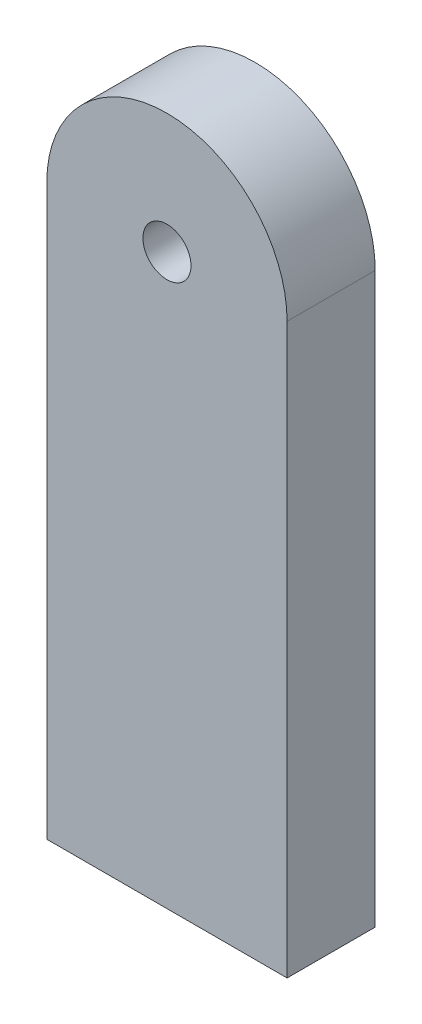
ISO-10303-21;
HEADER;
FILE_DESCRIPTION(('STEP AP214'),'2;1');
FILE_NAME('part.step','',(''),(''),'','','');
FILE_SCHEMA(('AUTOMOTIVE_DESIGN { 1 0 10303 214 1 1 1 1 }'));
ENDSEC;
DATA;
#1=APPLICATION_CONTEXT('core data for automotive mechanical design processes');
#2=APPLICATION_PROTOCOL_DEFINITION('international standard','automotive_design',2000,#1);
#3=PRODUCT_CONTEXT('',#1,'mechanical');
#4=PRODUCT('Part','Part','',(#3));
#5=PRODUCT_RELATED_PRODUCT_CATEGORY('part','',(#4));
#6=PRODUCT_DEFINITION_FORMATION('','',#4);
#7=PRODUCT_DEFINITION_CONTEXT('part definition',#1,'design');
#8=PRODUCT_DEFINITION('design','',#6,#7);
#9=PRODUCT_DEFINITION_SHAPE('','',#8);
#10=(LENGTH_UNIT() NAMED_UNIT(*) SI_UNIT(.MILLI.,.METRE.));
#11=(NAMED_UNIT(*) PLANE_ANGLE_UNIT() SI_UNIT($,.RADIAN.));
#12=(NAMED_UNIT(*) SI_UNIT($,.STERADIAN.) SOLID_ANGLE_UNIT());
#13=UNCERTAINTY_MEASURE_WITH_UNIT(LENGTH_MEASURE(1.E-05),#10,'distance_accuracy_value','');
#14=(GEOMETRIC_REPRESENTATION_CONTEXT(3) GLOBAL_UNCERTAINTY_ASSIGNED_CONTEXT((#13)) GLOBAL_UNIT_ASSIGNED_CONTEXT((#10,
#11,#12)) REPRESENTATION_CONTEXT('',''));
#15=CARTESIAN_POINT('',(0.,0.,0.));
#16=DIRECTION('',(0.,0.,1.));
#17=DIRECTION('',(1.,0.,0.));
#18=AXIS2_PLACEMENT_3D('',#15,#16,#17);
#19=CARTESIAN_POINT('',(-0.0428818166233677,0.0822453345982986,2.5));
#20=DIRECTION('',(0.,0.,-1.));
#21=DIRECTION('',(-1.,0.,0.));
#22=AXIS2_PLACEMENT_3D('',#19,#20,#21);
#23=CYLINDRICAL_SURFACE('',#22,7.5);
#24=CARTESIAN_POINT('',(-0.0428818166233677,0.0822453345982986,0.));
#25=DIRECTION('',(0.,0.,1.));
#26=DIRECTION('',(1.,0.,0.));
#27=AXIS2_PLACEMENT_3D('',#24,#25,#26);
#28=CIRCLE('',#27,7.5);
#29=CARTESIAN_POINT('',(7.45711818337663,0.0822453345983,0.));
#30=VERTEX_POINT('',#29);
#31=CARTESIAN_POINT('',(-7.54288181662337,0.0822453345982986,0.));
#32=VERTEX_POINT('',#31);
#33=EDGE_CURVE('E122',#30,#32,#28,.T.);
#34=ORIENTED_EDGE('',*,*,#33,.T.);
#35=DIRECTION('',(0.,0.,-1.));
#36=VECTOR('',#35,1.);
#37=CARTESIAN_POINT('',(-7.54288181662337,0.0822453345982986,2.5));
#38=LINE('',#37,#36);
#39=CARTESIAN_POINT('',(-7.54288181662337,0.0822453345982986,5.5));
#40=VERTEX_POINT('',#39);
#41=EDGE_CURVE('E11',#40,#32,#38,.T.);
#42=ORIENTED_EDGE('',*,*,#41,.F.);
#43=CARTESIAN_POINT('',(-0.0428818166233677,0.0822453345982986,5.5));
#44=DIRECTION('',(0.,0.,1.));
#45=DIRECTION('',(1.,0.,0.));
#46=AXIS2_PLACEMENT_3D('',#43,#44,#45);
#47=CIRCLE('',#46,7.5);
#48=CARTESIAN_POINT('',(7.45711818337663,0.0822453345983,5.5));
#49=VERTEX_POINT('',#48);
#50=EDGE_CURVE('E188',#49,#40,#47,.T.);
#51=ORIENTED_EDGE('',*,*,#50,.F.);
#52=DIRECTION('',(0.,0.,-1.));
#53=VECTOR('',#52,1.);
#54=CARTESIAN_POINT('',(7.45711818337663,0.0822453345983,2.5));
#55=LINE('',#54,#53);
#56=EDGE_CURVE('E108',#49,#30,#55,.T.);
#57=ORIENTED_EDGE('',*,*,#56,.T.);
#58=EDGE_LOOP('',(#34,#42,#51,#57));
#59=FACE_BOUND('',#58,.T.);
#60=ADVANCED_FACE('F43',(#59),#23,.T.);
#61=CARTESIAN_POINT('',(-7.54288181662337,0.,2.5));
#62=DIRECTION('',(-1.,0.,0.));
#63=DIRECTION('',(0.,-1.,0.));
#64=AXIS2_PLACEMENT_3D('',#61,#62,#63);
#65=PLANE('',#64);
#66=DIRECTION('',(0.,1.,0.));
#67=VECTOR('',#66,1.);
#68=CARTESIAN_POINT('',(-7.54288181662337,0.,0.));
#69=LINE('',#68,#67);
#70=CARTESIAN_POINT('',(-7.54288181662337,-35.4177546654017,0.));
#71=VERTEX_POINT('',#70);
#72=EDGE_CURVE('E117',#71,#32,#69,.T.);
#73=ORIENTED_EDGE('',*,*,#72,.F.);
#74=DIRECTION('',(0.,0.,-1.));
#75=VECTOR('',#74,1.);
#76=CARTESIAN_POINT('',(-7.54288181662337,-35.4177546654017,2.5));
#77=LINE('',#76,#75);
#78=CARTESIAN_POINT('',(-7.54288181662337,-35.4177546654017,5.5));
#79=VERTEX_POINT('',#78);
#80=EDGE_CURVE('E53',#79,#71,#77,.T.);
#81=ORIENTED_EDGE('',*,*,#80,.F.);
#82=DIRECTION('',(0.,-1.,0.));
#83=VECTOR('',#82,1.);
#84=CARTESIAN_POINT('',(-7.54288181662337,-35.4177546654017,5.5));
#85=LINE('',#84,#83);
#86=EDGE_CURVE('E183',#40,#79,#85,.T.);
#87=ORIENTED_EDGE('',*,*,#86,.F.);
#88=ORIENTED_EDGE('',*,*,#41,.T.);
#89=EDGE_LOOP('',(#73,#81,#87,#88));
#90=FACE_BOUND('',#89,.T.);
#91=ADVANCED_FACE('F177',(#90),#65,.T.);
#92=CARTESIAN_POINT('',(0.,-35.4177546654017,2.5));
#93=DIRECTION('',(0.,-1.,0.));
#94=DIRECTION('',(0.,0.,-1.));
#95=AXIS2_PLACEMENT_3D('',#92,#93,#94);
#96=PLANE('',#95);
#97=DIRECTION('',(-1.,0.,0.));
#98=VECTOR('',#97,1.);
#99=CARTESIAN_POINT('',(0.,-35.4177546654017,0.));
#100=LINE('',#99,#98);
#101=CARTESIAN_POINT('',(7.45711818337665,-35.4177546654017,0.));
#102=VERTEX_POINT('',#101);
#103=EDGE_CURVE('E111',#102,#71,#100,.T.);
#104=ORIENTED_EDGE('',*,*,#103,.F.);
#105=DIRECTION('',(0.,0.,-1.));
#106=VECTOR('',#105,1.);
#107=CARTESIAN_POINT('',(7.45711818337665,-35.4177546654017,2.5));
#108=LINE('',#107,#106);
#109=CARTESIAN_POINT('',(7.45711818337665,-35.4177546654017,5.5));
#110=VERTEX_POINT('',#109);
#111=EDGE_CURVE('E96',#110,#102,#108,.T.);
#112=ORIENTED_EDGE('',*,*,#111,.F.);
#113=DIRECTION('',(1.,0.,0.));
#114=VECTOR('',#113,1.);
#115=CARTESIAN_POINT('',(7.45711818337665,-35.4177546654017,5.5));
#116=LINE('',#115,#114);
#117=EDGE_CURVE('E194',#79,#110,#116,.T.);
#118=ORIENTED_EDGE('',*,*,#117,.F.);
#119=ORIENTED_EDGE('',*,*,#80,.T.);
#120=EDGE_LOOP('',(#104,#112,#118,#119));
#121=FACE_BOUND('',#120,.T.);
#122=ADVANCED_FACE('F112',(#121),#96,.T.);
#123=CARTESIAN_POINT('',(0.,-2.81893976807957,2.5));
#124=DIRECTION('',(0.,1.,0.));
#125=DIRECTION('',(0.,0.,1.));
#126=AXIS2_PLACEMENT_3D('',#123,#124,#125);
#127=PLANE('',#126);
#128=DIRECTION('',(1.,0.,0.));
#129=VECTOR('',#128,1.);
#130=CARTESIAN_POINT('',(0.,-2.81893976807957,0.));
#131=LINE('',#130,#129);
#132=CARTESIAN_POINT('',(-1.71788181662337,-2.81893976807957,0.));
#133=VERTEX_POINT('',#132);
#134=CARTESIAN_POINT('',(1.63211818337673,-2.81893976807957,0.));
#135=VERTEX_POINT('',#134);
#136=EDGE_CURVE('E157',#133,#135,#131,.T.);
#137=ORIENTED_EDGE('',*,*,#136,.F.);
#138=DIRECTION('',(0.,0.,-1.));
#139=VECTOR('',#138,1.);
#140=CARTESIAN_POINT('',(-1.71788181662337,-2.81893976807957,2.5));
#141=LINE('',#140,#139);
#142=CARTESIAN_POINT('',(-1.71788181662337,-2.81893976807957,2.5));
#143=VERTEX_POINT('',#142);
#144=EDGE_CURVE('E47',#143,#133,#141,.T.);
#145=ORIENTED_EDGE('',*,*,#144,.F.);
#146=DIRECTION('',(1.,0.,0.));
#147=VECTOR('',#146,1.);
#148=CARTESIAN_POINT('',(0.,-2.81893976807957,2.5));
#149=LINE('',#148,#147);
#150=CARTESIAN_POINT('',(1.63211818337673,-2.81893976807957,2.5));
#151=VERTEX_POINT('',#150);
#152=EDGE_CURVE('E123',#143,#151,#149,.T.);
#153=ORIENTED_EDGE('',*,*,#152,.T.);
#154=DIRECTION('',(0.,0.,-1.));
#155=VECTOR('',#154,1.);
#156=CARTESIAN_POINT('',(1.63211818337673,-2.81893976807957,2.5));
#157=LINE('',#156,#155);
#158=EDGE_CURVE('E132',#151,#135,#157,.T.);
#159=ORIENTED_EDGE('',*,*,#158,.T.);
#160=EDGE_LOOP('',(#137,#145,#153,#159));
#161=FACE_BOUND('',#160,.T.);
#162=ADVANCED_FACE('F45',(#161),#127,.T.);
#163=CARTESIAN_POINT('',(-2.50904808791509,-1.44859958896749,2.5));
#164=DIRECTION('',(0.866025403784439,0.5,0.));
#165=DIRECTION('',(-0.5,0.866025403784439,0.));
#166=AXIS2_PLACEMENT_3D('',#163,#164,#165);
#167=PLANE('',#166);
#168=DIRECTION('',(0.5,-0.866025403784439,0.));
#169=VECTOR('',#168,1.);
#170=CARTESIAN_POINT('',(-2.50904808791509,-1.44859958896749,0.));
#171=LINE('',#170,#169);
#172=CARTESIAN_POINT('',(-3.39288181662337,0.0822453345982986,0.));
#173=VERTEX_POINT('',#172);
#174=EDGE_CURVE('E152',#173,#133,#171,.T.);
#175=ORIENTED_EDGE('',*,*,#174,.F.);
#176=DIRECTION('',(0.,0.,-1.));
#177=VECTOR('',#176,1.);
#178=CARTESIAN_POINT('',(-3.39288181662337,0.0822453345982986,2.5));
#179=LINE('',#178,#177);
#180=CARTESIAN_POINT('',(-3.39288181662337,0.0822453345982986,2.5));
#181=VERTEX_POINT('',#180);
#182=EDGE_CURVE('E140',#181,#173,#179,.T.);
#183=ORIENTED_EDGE('',*,*,#182,.F.);
#184=DIRECTION('',(0.5,-0.866025403784439,0.));
#185=VECTOR('',#184,1.);
#186=CARTESIAN_POINT('',(-2.50904808791509,-1.44859958896749,2.5));
#187=LINE('',#186,#185);
#188=EDGE_CURVE('E126',#181,#143,#187,.T.);
#189=ORIENTED_EDGE('',*,*,#188,.T.);
#190=ORIENTED_EDGE('',*,*,#144,.T.);
#191=EDGE_LOOP('',(#175,#183,#189,#190));
#192=FACE_BOUND('',#191,.T.);
#193=ADVANCED_FACE('F150',(#192),#167,.T.);
#194=CARTESIAN_POINT('',(-2.58027463702004,1.48972225626659,2.5));
#195=DIRECTION('',(0.866025403784452,-0.499999999999977,0.));
#196=DIRECTION('',(0.499999999999977,0.866025403784452,0.));
#197=AXIS2_PLACEMENT_3D('',#194,#195,#196);
#198=PLANE('',#197);
#199=DIRECTION('',(-0.499999999999977,-0.866025403784452,0.));
#200=VECTOR('',#199,1.);
#201=CARTESIAN_POINT('',(-2.58027463702004,1.48972225626659,0.));
#202=LINE('',#201,#200);
#203=CARTESIAN_POINT('',(-1.71788181662344,2.98343043727622,0.));
#204=VERTEX_POINT('',#203);
#205=EDGE_CURVE('E164',#204,#173,#202,.T.);
#206=ORIENTED_EDGE('',*,*,#205,.F.);
#207=DIRECTION('',(0.,0.,-1.));
#208=VECTOR('',#207,1.);
#209=CARTESIAN_POINT('',(-1.71788181662344,2.98343043727622,2.5));
#210=LINE('',#209,#208);
#211=CARTESIAN_POINT('',(-1.71788181662344,2.98343043727622,2.5));
#212=VERTEX_POINT('',#211);
#213=EDGE_CURVE('E139',#212,#204,#210,.T.);
#214=ORIENTED_EDGE('',*,*,#213,.F.);
#215=DIRECTION('',(-0.499999999999977,-0.866025403784452,0.));
#216=VECTOR('',#215,1.);
#217=CARTESIAN_POINT('',(-2.58027463702004,1.48972225626659,2.5));
#218=LINE('',#217,#216);
#219=EDGE_CURVE('E200',#212,#181,#218,.T.);
#220=ORIENTED_EDGE('',*,*,#219,.T.);
#221=ORIENTED_EDGE('',*,*,#182,.T.);
#222=EDGE_LOOP('',(#206,#214,#220,#221));
#223=FACE_BOUND('',#222,.T.);
#224=ADVANCED_FACE('F221',(#223),#198,.T.);
#225=CARTESIAN_POINT('',(0.,2.98343043727621,2.5));
#226=DIRECTION('',(0.,-1.,0.));
#227=DIRECTION('',(1.,0.,0.));
#228=AXIS2_PLACEMENT_3D('',#225,#226,#227);
#229=PLANE('',#228);
#230=DIRECTION('',(-1.,0.,0.));
#231=VECTOR('',#230,1.);
#232=CARTESIAN_POINT('',(0.,2.98343043727621,0.));
#233=LINE('',#232,#231);
#234=CARTESIAN_POINT('',(1.63211818337661,2.98343043727621,0.));
#235=VERTEX_POINT('',#234);
#236=EDGE_CURVE('E166',#235,#204,#233,.T.);
#237=ORIENTED_EDGE('',*,*,#236,.F.);
#238=DIRECTION('',(0.,0.,-1.));
#239=VECTOR('',#238,1.);
#240=CARTESIAN_POINT('',(1.63211818337661,2.98343043727621,2.5));
#241=LINE('',#240,#239);
#242=CARTESIAN_POINT('',(1.63211818337661,2.98343043727621,2.5));
#243=VERTEX_POINT('',#242);
#244=EDGE_CURVE('E137',#243,#235,#241,.T.);
#245=ORIENTED_EDGE('',*,*,#244,.F.);
#246=DIRECTION('',(-1.,0.,0.));
#247=VECTOR('',#246,1.);
#248=CARTESIAN_POINT('',(0.,2.98343043727621,2.5));
#249=LINE('',#248,#247);
#250=EDGE_CURVE('E202',#243,#212,#249,.T.);
#251=ORIENTED_EDGE('',*,*,#250,.T.);
#252=ORIENTED_EDGE('',*,*,#213,.T.);
#253=EDGE_LOOP('',(#237,#245,#251,#252));
#254=FACE_BOUND('',#253,.T.);
#255=ADVANCED_FACE('F225',(#254),#229,.T.);
#256=CARTESIAN_POINT('',(2.51595191208491,1.45258551371038,2.5));
#257=DIRECTION('',(-0.866025403784439,-0.5,0.));
#258=DIRECTION('',(0.5,-0.866025403784439,0.));
#259=AXIS2_PLACEMENT_3D('',#256,#257,#258);
#260=PLANE('',#259);
#261=DIRECTION('',(-0.5,0.866025403784439,0.));
#262=VECTOR('',#261,1.);
#263=CARTESIAN_POINT('',(2.51595191208491,1.45258551371038,0.));
#264=LINE('',#263,#262);
#265=CARTESIAN_POINT('',(3.30711818337663,0.0822453345982995,0.));
#266=VERTEX_POINT('',#265);
#267=EDGE_CURVE('E171',#266,#235,#264,.T.);
#268=ORIENTED_EDGE('',*,*,#267,.F.);
#269=DIRECTION('',(0.,0.,-1.));
#270=VECTOR('',#269,1.);
#271=CARTESIAN_POINT('',(3.30711818337663,0.0822453345982995,2.5));
#272=LINE('',#271,#270);
#273=CARTESIAN_POINT('',(3.30711818337663,0.0822453345982995,2.5));
#274=VERTEX_POINT('',#273);
#275=EDGE_CURVE('E134',#274,#266,#272,.T.);
#276=ORIENTED_EDGE('',*,*,#275,.F.);
#277=DIRECTION('',(-0.5,0.866025403784439,0.));
#278=VECTOR('',#277,1.);
#279=CARTESIAN_POINT('',(2.51595191208491,1.45258551371038,2.5));
#280=LINE('',#279,#278);
#281=EDGE_CURVE('E61',#274,#243,#280,.T.);
#282=ORIENTED_EDGE('',*,*,#281,.T.);
#283=ORIENTED_EDGE('',*,*,#244,.T.);
#284=EDGE_LOOP('',(#268,#276,#282,#283));
#285=FACE_BOUND('',#284,.T.);
#286=ADVANCED_FACE('F227',(#285),#260,.T.);
#287=CARTESIAN_POINT('',(2.44472536298011,-1.41146284641119,2.5));
#288=DIRECTION('',(-0.866025403784452,0.499999999999978,0.));
#289=DIRECTION('',(-0.499999999999978,-0.866025403784452,0.));
#290=AXIS2_PLACEMENT_3D('',#287,#288,#289);
#291=PLANE('',#290);
#292=DIRECTION('',(0.499999999999978,0.866025403784452,0.));
#293=VECTOR('',#292,1.);
#294=CARTESIAN_POINT('',(2.44472536298011,-1.41146284641119,0.));
#295=LINE('',#294,#293);
#296=EDGE_CURVE('E174',#135,#266,#295,.T.);
#297=ORIENTED_EDGE('',*,*,#296,.F.);
#298=ORIENTED_EDGE('',*,*,#158,.F.);
#299=DIRECTION('',(0.499999999999978,0.866025403784452,0.));
#300=VECTOR('',#299,1.);
#301=CARTESIAN_POINT('',(2.44472536298011,-1.41146284641119,2.5));
#302=LINE('',#301,#300);
#303=EDGE_CURVE('E135',#151,#274,#302,.T.);
#304=ORIENTED_EDGE('',*,*,#303,.T.);
#305=ORIENTED_EDGE('',*,*,#275,.T.);
#306=EDGE_LOOP('',(#297,#298,#304,#305));
#307=FACE_BOUND('',#306,.T.);
#308=ADVANCED_FACE('F207',(#307),#291,.T.);
#309=CARTESIAN_POINT('',(7.45711818337663,0.,2.5));
#310=DIRECTION('',(1.,0.,0.));
#311=DIRECTION('',(0.,1.,0.));
#312=AXIS2_PLACEMENT_3D('',#309,#310,#311);
#313=PLANE('',#312);
#314=DIRECTION('',(0.,-1.,0.));
#315=VECTOR('',#314,1.);
#316=CARTESIAN_POINT('',(7.45711818337663,0.,0.));
#317=LINE('',#316,#315);
#318=EDGE_CURVE('E101',#30,#102,#317,.T.);
#319=ORIENTED_EDGE('',*,*,#318,.F.);
#320=ORIENTED_EDGE('',*,*,#56,.F.);
#321=DIRECTION('',(0.,1.,0.));
#322=VECTOR('',#321,1.);
#323=CARTESIAN_POINT('',(7.45711818337663,0.0822453345983,5.5));
#324=LINE('',#323,#322);
#325=EDGE_CURVE('E104',#110,#49,#324,.T.);
#326=ORIENTED_EDGE('',*,*,#325,.F.);
#327=ORIENTED_EDGE('',*,*,#111,.T.);
#328=EDGE_LOOP('',(#319,#320,#326,#327));
#329=FACE_BOUND('',#328,.T.);
#330=ADVANCED_FACE('F98',(#329),#313,.T.);
#331=CARTESIAN_POINT('',(0.,0.,0.));
#332=DIRECTION('',(0.,0.,1.));
#333=DIRECTION('',(1.,0.,0.));
#334=AXIS2_PLACEMENT_3D('',#331,#332,#333);
#335=PLANE('',#334);
#336=ORIENTED_EDGE('',*,*,#136,.T.);
#337=ORIENTED_EDGE('',*,*,#296,.T.);
#338=ORIENTED_EDGE('',*,*,#267,.T.);
#339=ORIENTED_EDGE('',*,*,#236,.T.);
#340=ORIENTED_EDGE('',*,*,#205,.T.);
#341=ORIENTED_EDGE('',*,*,#174,.T.);
#342=EDGE_LOOP('',(#336,#337,#338,#339,#340,#341));
#343=FACE_BOUND('',#342,.T.);
#344=ORIENTED_EDGE('',*,*,#33,.F.);
#345=ORIENTED_EDGE('',*,*,#318,.T.);
#346=ORIENTED_EDGE('',*,*,#103,.T.);
#347=ORIENTED_EDGE('',*,*,#72,.T.);
#348=EDGE_LOOP('',(#344,#345,#346,#347));
#349=FACE_BOUND('',#348,.T.);
#350=ADVANCED_FACE('F120',(#343,#349),#335,.F.);
#351=CARTESIAN_POINT('',(-0.0428818166233677,0.0822453345982986,5.5));
#352=DIRECTION('',(0.,0.,1.));
#353=DIRECTION('',(1.,0.,0.));
#354=AXIS2_PLACEMENT_3D('',#351,#352,#353);
#355=PLANE('',#354);
#356=ORIENTED_EDGE('',*,*,#50,.T.);
#357=ORIENTED_EDGE('',*,*,#86,.T.);
#358=ORIENTED_EDGE('',*,*,#117,.T.);
#359=ORIENTED_EDGE('',*,*,#325,.T.);
#360=EDGE_LOOP('',(#356,#357,#358,#359));
#361=FACE_BOUND('',#360,.T.);
#362=CARTESIAN_POINT('',(-0.0428818166233677,0.0822453345982986,5.5));
#363=DIRECTION('',(0.,0.,1.));
#364=DIRECTION('',(1.,0.,0.));
#365=AXIS2_PLACEMENT_3D('',#362,#363,#364);
#366=CIRCLE('',#365,1.5);
#367=CARTESIAN_POINT('',(1.45711818337663,0.0822453345982986,5.5));
#368=VERTEX_POINT('',#367);
#369=EDGE_CURVE('E261',#368,#368,#366,.T.);
#370=ORIENTED_EDGE('',*,*,#369,.F.);
#371=EDGE_LOOP('',(#370));
#372=FACE_BOUND('',#371,.T.);
#373=ADVANCED_FACE('F192',(#361,#372),#355,.T.);
#374=CARTESIAN_POINT('',(-0.0428818166233677,0.0822453345982986,2.5));
#375=DIRECTION('',(0.,0.,1.));
#376=DIRECTION('',(1.,0.,0.));
#377=AXIS2_PLACEMENT_3D('',#374,#375,#376);
#378=PLANE('',#377);
#379=ORIENTED_EDGE('',*,*,#152,.F.);
#380=ORIENTED_EDGE('',*,*,#188,.F.);
#381=ORIENTED_EDGE('',*,*,#219,.F.);
#382=ORIENTED_EDGE('',*,*,#250,.F.);
#383=ORIENTED_EDGE('',*,*,#281,.F.);
#384=ORIENTED_EDGE('',*,*,#303,.F.);
#385=EDGE_LOOP('',(#379,#380,#381,#382,#383,#384));
#386=FACE_BOUND('',#385,.T.);
#387=CARTESIAN_POINT('',(-0.0428818166233677,0.0822453345982986,2.5));
#388=DIRECTION('',(0.,0.,1.));
#389=DIRECTION('',(1.,0.,0.));
#390=AXIS2_PLACEMENT_3D('',#387,#388,#389);
#391=CIRCLE('',#390,1.5);
#392=CARTESIAN_POINT('',(1.45711818337663,0.0822453345982986,2.5));
#393=VERTEX_POINT('',#392);
#394=EDGE_CURVE('E264',#393,#393,#391,.T.);
#395=ORIENTED_EDGE('',*,*,#394,.T.);
#396=EDGE_LOOP('',(#395));
#397=FACE_BOUND('',#396,.T.);
#398=ADVANCED_FACE('F210',(#386,#397),#378,.F.);
#399=CARTESIAN_POINT('',(-0.0428818166233677,0.0822453345982986,5.5));
#400=DIRECTION('',(0.,0.,-1.));
#401=DIRECTION('',(-1.,0.,0.));
#402=AXIS2_PLACEMENT_3D('',#399,#400,#401);
#403=CYLINDRICAL_SURFACE('',#402,1.5);
#404=ORIENTED_EDGE('',*,*,#369,.T.);
#405=EDGE_LOOP('',(#404));
#406=FACE_BOUND('',#405,.T.);
#407=ORIENTED_EDGE('',*,*,#394,.F.);
#408=EDGE_LOOP('',(#407));
#409=FACE_BOUND('',#408,.T.);
#410=ADVANCED_FACE('F251',(#406,#409),#403,.F.);
#411=CLOSED_SHELL('',(#60,#91,#122,#162,#193,#224,#255,#286,#308,#330,#350,#373,#398,#410));
#412=MANIFOLD_SOLID_BREP('B2',#411);
#413=ADVANCED_BREP_SHAPE_REPRESENTATION('',(#18,#412),#14);
#414=SHAPE_DEFINITION_REPRESENTATION(#9,#413);
ENDSEC;
END-ISO-10303-21;
